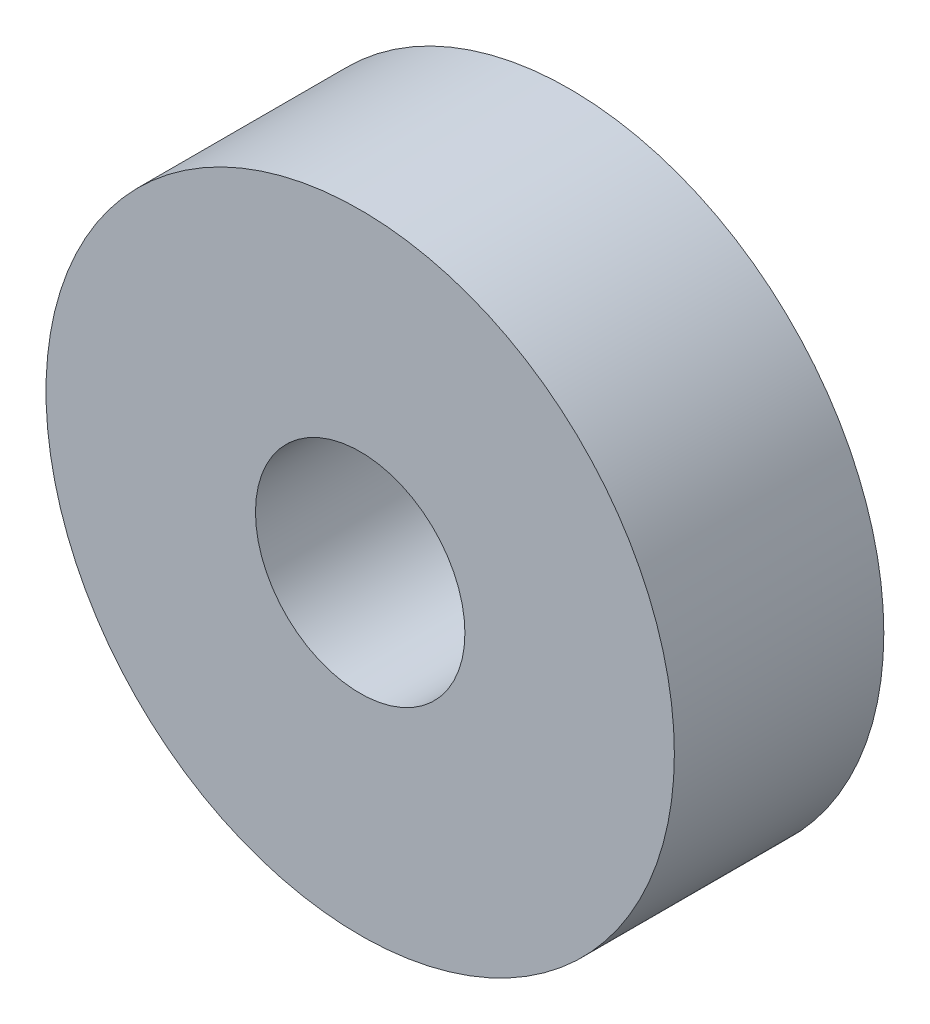
ISO-10303-21;
HEADER;
FILE_DESCRIPTION(('STEP AP214'),'2;1');
FILE_NAME('part.step','',(''),(''),'','','');
FILE_SCHEMA(('AUTOMOTIVE_DESIGN { 1 0 10303 214 1 1 1 1 }'));
ENDSEC;
DATA;
#1=APPLICATION_CONTEXT('core data for automotive mechanical design processes');
#2=APPLICATION_PROTOCOL_DEFINITION('international standard','automotive_design',2000,#1);
#3=PRODUCT_CONTEXT('',#1,'mechanical');
#4=PRODUCT('Part','Part','',(#3));
#5=PRODUCT_RELATED_PRODUCT_CATEGORY('part','',(#4));
#6=PRODUCT_DEFINITION_FORMATION('','',#4);
#7=PRODUCT_DEFINITION_CONTEXT('part definition',#1,'design');
#8=PRODUCT_DEFINITION('design','',#6,#7);
#9=PRODUCT_DEFINITION_SHAPE('','',#8);
#10=(LENGTH_UNIT() NAMED_UNIT(*) SI_UNIT(.MILLI.,.METRE.));
#11=(NAMED_UNIT(*) PLANE_ANGLE_UNIT() SI_UNIT($,.RADIAN.));
#12=(NAMED_UNIT(*) SI_UNIT($,.STERADIAN.) SOLID_ANGLE_UNIT());
#13=UNCERTAINTY_MEASURE_WITH_UNIT(LENGTH_MEASURE(1.E-05),#10,'distance_accuracy_value','');
#14=(GEOMETRIC_REPRESENTATION_CONTEXT(3) GLOBAL_UNCERTAINTY_ASSIGNED_CONTEXT((#13)) GLOBAL_UNIT_ASSIGNED_CONTEXT((#10,
#11,#12)) REPRESENTATION_CONTEXT('',''));
#15=CARTESIAN_POINT('',(0.,0.,0.));
#16=DIRECTION('',(0.,0.,1.));
#17=DIRECTION('',(1.,0.,0.));
#18=AXIS2_PLACEMENT_3D('',#15,#16,#17);
#19=CARTESIAN_POINT('',(0.,0.,4.));
#20=DIRECTION('',(0.,0.,1.));
#21=DIRECTION('',(1.,0.,0.));
#22=AXIS2_PLACEMENT_3D('',#19,#20,#21);
#23=PLANE('',#22);
#24=CARTESIAN_POINT('',(0.,0.,4.));
#25=DIRECTION('',(0.,0.,1.));
#26=DIRECTION('',(1.,0.,0.));
#27=AXIS2_PLACEMENT_3D('',#24,#25,#26);
#28=CIRCLE('',#27,6.);
#29=CARTESIAN_POINT('',(6.,0.,4.));
#30=VERTEX_POINT('',#29);
#31=EDGE_CURVE('E10',#30,#30,#28,.T.);
#32=ORIENTED_EDGE('',*,*,#31,.T.);
#33=EDGE_LOOP('',(#32));
#34=FACE_BOUND('',#33,.T.);
#35=CARTESIAN_POINT('',(0.,0.,4.));
#36=DIRECTION('',(0.,0.,1.));
#37=DIRECTION('',(1.,0.,0.));
#38=AXIS2_PLACEMENT_3D('',#35,#36,#37);
#39=CIRCLE('',#38,2.);
#40=CARTESIAN_POINT('',(2.,0.,4.));
#41=VERTEX_POINT('',#40);
#42=EDGE_CURVE('E50',#41,#41,#39,.T.);
#43=ORIENTED_EDGE('',*,*,#42,.F.);
#44=EDGE_LOOP('',(#43));
#45=FACE_BOUND('',#44,.T.);
#46=ADVANCED_FACE('F37',(#34,#45),#23,.T.);
#47=CARTESIAN_POINT('',(0.,0.,0.));
#48=DIRECTION('',(0.,0.,1.));
#49=DIRECTION('',(1.,0.,0.));
#50=AXIS2_PLACEMENT_3D('',#47,#48,#49);
#51=PLANE('',#50);
#52=CARTESIAN_POINT('',(0.,0.,0.));
#53=DIRECTION('',(0.,0.,1.));
#54=DIRECTION('',(1.,0.,0.));
#55=AXIS2_PLACEMENT_3D('',#52,#53,#54);
#56=CIRCLE('',#55,6.);
#57=CARTESIAN_POINT('',(6.,0.,0.));
#58=VERTEX_POINT('',#57);
#59=EDGE_CURVE('E41',#58,#58,#56,.T.);
#60=ORIENTED_EDGE('',*,*,#59,.F.);
#61=EDGE_LOOP('',(#60));
#62=FACE_BOUND('',#61,.T.);
#63=CARTESIAN_POINT('',(0.,0.,0.));
#64=DIRECTION('',(0.,0.,1.));
#65=DIRECTION('',(1.,0.,0.));
#66=AXIS2_PLACEMENT_3D('',#63,#64,#65);
#67=CIRCLE('',#66,2.);
#68=CARTESIAN_POINT('',(2.,0.,0.));
#69=VERTEX_POINT('',#68);
#70=EDGE_CURVE('E52',#69,#69,#67,.T.);
#71=ORIENTED_EDGE('',*,*,#70,.T.);
#72=EDGE_LOOP('',(#71));
#73=FACE_BOUND('',#72,.T.);
#74=ADVANCED_FACE('F64',(#62,#73),#51,.F.);
#75=CARTESIAN_POINT('',(0.,0.,4.));
#76=DIRECTION('',(0.,0.,-1.));
#77=DIRECTION('',(-1.,0.,0.));
#78=AXIS2_PLACEMENT_3D('',#75,#76,#77);
#79=CYLINDRICAL_SURFACE('',#78,6.);
#80=ORIENTED_EDGE('',*,*,#31,.F.);
#81=EDGE_LOOP('',(#80));
#82=FACE_BOUND('',#81,.T.);
#83=ORIENTED_EDGE('',*,*,#59,.T.);
#84=EDGE_LOOP('',(#83));
#85=FACE_BOUND('',#84,.T.);
#86=ADVANCED_FACE('F39',(#82,#85),#79,.T.);
#87=CARTESIAN_POINT('',(0.,0.,4.));
#88=DIRECTION('',(0.,0.,-1.));
#89=DIRECTION('',(-1.,0.,0.));
#90=AXIS2_PLACEMENT_3D('',#87,#88,#89);
#91=CYLINDRICAL_SURFACE('',#90,2.);
#92=ORIENTED_EDGE('',*,*,#42,.T.);
#93=EDGE_LOOP('',(#92));
#94=FACE_BOUND('',#93,.T.);
#95=ORIENTED_EDGE('',*,*,#70,.F.);
#96=EDGE_LOOP('',(#95));
#97=FACE_BOUND('',#96,.T.);
#98=ADVANCED_FACE('F60',(#94,#97),#91,.F.);
#99=CLOSED_SHELL('',(#46,#74,#86,#98));
#100=MANIFOLD_SOLID_BREP('B2',#99);
#101=ADVANCED_BREP_SHAPE_REPRESENTATION('',(#18,#100),#14);
#102=SHAPE_DEFINITION_REPRESENTATION(#9,#101);
ENDSEC;
END-ISO-10303-21;
